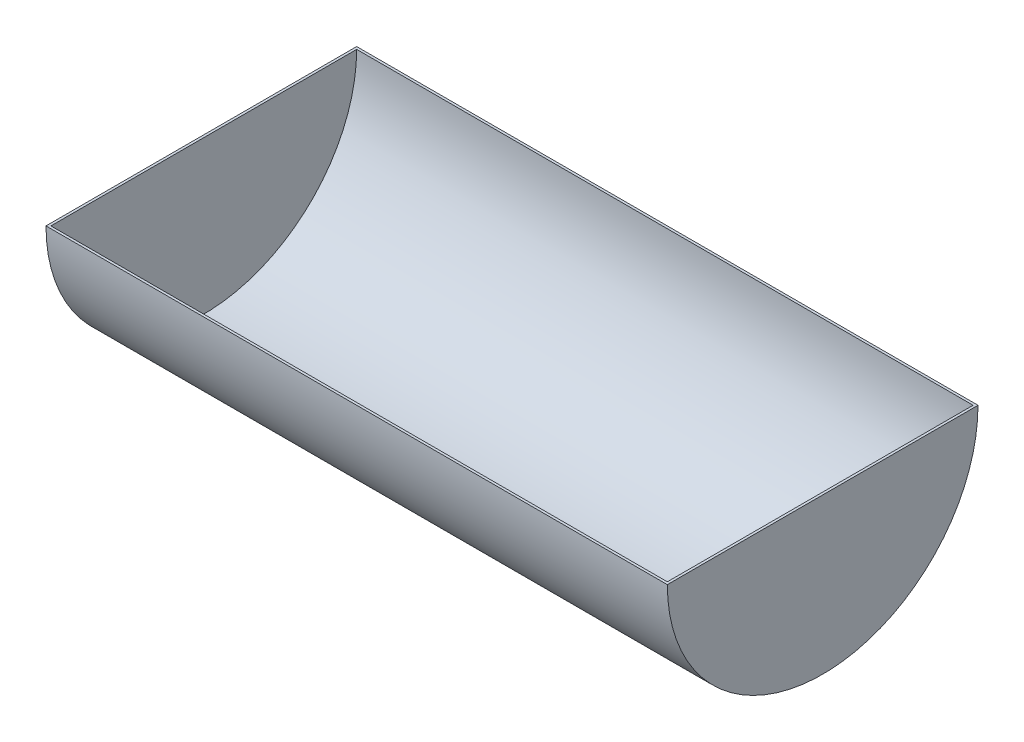
ISO-10303-21;
HEADER;
FILE_DESCRIPTION(('STEP AP214'),'2;1');
FILE_NAME('part.step','',(''),(''),'','','');
FILE_SCHEMA(('AUTOMOTIVE_DESIGN { 1 0 10303 214 1 1 1 1 }'));
ENDSEC;
DATA;
#1=APPLICATION_CONTEXT('core data for automotive mechanical design processes');
#2=APPLICATION_PROTOCOL_DEFINITION('international standard','automotive_design',2000,#1);
#3=PRODUCT_CONTEXT('',#1,'mechanical');
#4=PRODUCT('Part','Part','',(#3));
#5=PRODUCT_RELATED_PRODUCT_CATEGORY('part','',(#4));
#6=PRODUCT_DEFINITION_FORMATION('','',#4);
#7=PRODUCT_DEFINITION_CONTEXT('part definition',#1,'design');
#8=PRODUCT_DEFINITION('design','',#6,#7);
#9=PRODUCT_DEFINITION_SHAPE('','',#8);
#10=(LENGTH_UNIT() NAMED_UNIT(*) SI_UNIT(.MILLI.,.METRE.));
#11=(NAMED_UNIT(*) PLANE_ANGLE_UNIT() SI_UNIT($,.RADIAN.));
#12=(NAMED_UNIT(*) SI_UNIT($,.STERADIAN.) SOLID_ANGLE_UNIT());
#13=UNCERTAINTY_MEASURE_WITH_UNIT(LENGTH_MEASURE(1.E-05),#10,'distance_accuracy_value','');
#14=(GEOMETRIC_REPRESENTATION_CONTEXT(3) GLOBAL_UNCERTAINTY_ASSIGNED_CONTEXT((#13)) GLOBAL_UNIT_ASSIGNED_CONTEXT((#10,
#11,#12)) REPRESENTATION_CONTEXT('',''));
#15=CARTESIAN_POINT('',(0.,0.,0.));
#16=DIRECTION('',(0.,0.,1.));
#17=DIRECTION('',(1.,0.,0.));
#18=AXIS2_PLACEMENT_3D('',#15,#16,#17);
#19=CARTESIAN_POINT('',(508.,0.,0.));
#20=DIRECTION('',(-1.,0.,0.));
#21=DIRECTION('',(0.,0.,1.));
#22=AXIS2_PLACEMENT_3D('',#19,#20,#21);
#23=CYLINDRICAL_SURFACE('',#22,125.);
#24=DIRECTION('',(-1.,0.,0.));
#25=VECTOR('',#24,1.);
#26=CARTESIAN_POINT('',(508.,0.,-125.));
#27=LINE('',#26,#25);
#28=CARTESIAN_POINT('',(506.,0.,-125.));
#29=VERTEX_POINT('',#28);
#30=CARTESIAN_POINT('',(2.,0.,-125.));
#31=VERTEX_POINT('',#30);
#32=EDGE_CURVE('E53',#29,#31,#27,.T.);
#33=ORIENTED_EDGE('',*,*,#32,.T.);
#34=CARTESIAN_POINT('',(2.,0.,0.));
#35=DIRECTION('',(1.,0.,0.));
#36=DIRECTION('',(0.,0.,-1.));
#37=AXIS2_PLACEMENT_3D('',#34,#35,#36);
#38=CIRCLE('',#37,125.);
#39=CARTESIAN_POINT('',(2.,0.,125.));
#40=VERTEX_POINT('',#39);
#41=EDGE_CURVE('E49',#40,#31,#38,.T.);
#42=ORIENTED_EDGE('',*,*,#41,.F.);
#43=DIRECTION('',(-1.,0.,0.));
#44=VECTOR('',#43,1.);
#45=CARTESIAN_POINT('',(508.,0.,125.));
#46=LINE('',#45,#44);
#47=CARTESIAN_POINT('',(506.,0.,125.));
#48=VERTEX_POINT('',#47);
#49=EDGE_CURVE('E11',#48,#40,#46,.T.);
#50=ORIENTED_EDGE('',*,*,#49,.F.);
#51=CARTESIAN_POINT('',(506.,0.,0.));
#52=DIRECTION('',(1.,0.,0.));
#53=DIRECTION('',(0.,0.,-1.));
#54=AXIS2_PLACEMENT_3D('',#51,#52,#53);
#55=CIRCLE('',#54,125.);
#56=EDGE_CURVE('E75',#48,#29,#55,.T.);
#57=ORIENTED_EDGE('',*,*,#56,.T.);
#58=EDGE_LOOP('',(#33,#42,#50,#57));
#59=FACE_BOUND('',#58,.T.);
#60=ADVANCED_FACE('F35',(#59),#23,.F.);
#61=CARTESIAN_POINT('',(508.,0.,0.));
#62=DIRECTION('',(-1.,0.,0.));
#63=DIRECTION('',(0.,0.,1.));
#64=AXIS2_PLACEMENT_3D('',#61,#62,#63);
#65=CYLINDRICAL_SURFACE('',#64,127.);
#66=CARTESIAN_POINT('',(0.,0.,0.));
#67=DIRECTION('',(1.,0.,0.));
#68=DIRECTION('',(0.,0.,-1.));
#69=AXIS2_PLACEMENT_3D('',#66,#67,#68);
#70=CIRCLE('',#69,127.);
#71=CARTESIAN_POINT('',(0.,0.,127.));
#72=VERTEX_POINT('',#71);
#73=CARTESIAN_POINT('',(0.,0.,-127.));
#74=VERTEX_POINT('',#73);
#75=EDGE_CURVE('E77',#72,#74,#70,.T.);
#76=ORIENTED_EDGE('',*,*,#75,.T.);
#77=DIRECTION('',(-1.,0.,0.));
#78=VECTOR('',#77,1.);
#79=CARTESIAN_POINT('',(508.,0.,-127.));
#80=LINE('',#79,#78);
#81=CARTESIAN_POINT('',(508.,0.,-127.));
#82=VERTEX_POINT('',#81);
#83=EDGE_CURVE('E85',#82,#74,#80,.T.);
#84=ORIENTED_EDGE('',*,*,#83,.F.);
#85=CARTESIAN_POINT('',(508.,0.,0.));
#86=DIRECTION('',(1.,0.,0.));
#87=DIRECTION('',(0.,0.,-1.));
#88=AXIS2_PLACEMENT_3D('',#85,#86,#87);
#89=CIRCLE('',#88,127.);
#90=CARTESIAN_POINT('',(508.,0.,127.));
#91=VERTEX_POINT('',#90);
#92=EDGE_CURVE('E86',#91,#82,#89,.T.);
#93=ORIENTED_EDGE('',*,*,#92,.F.);
#94=DIRECTION('',(-1.,0.,0.));
#95=VECTOR('',#94,1.);
#96=CARTESIAN_POINT('',(508.,0.,127.));
#97=LINE('',#96,#95);
#98=EDGE_CURVE('E42',#91,#72,#97,.T.);
#99=ORIENTED_EDGE('',*,*,#98,.T.);
#100=EDGE_LOOP('',(#76,#84,#93,#99));
#101=FACE_BOUND('',#100,.T.);
#102=ADVANCED_FACE('F101',(#101),#65,.T.);
#103=CARTESIAN_POINT('',(508.,0.,-127.));
#104=DIRECTION('',(0.,-1.,0.));
#105=DIRECTION('',(0.,0.,-1.));
#106=AXIS2_PLACEMENT_3D('',#103,#104,#105);
#107=PLANE('',#106);
#108=DIRECTION('',(0.,0.,1.));
#109=VECTOR('',#108,1.);
#110=CARTESIAN_POINT('',(2.,0.,125.));
#111=LINE('',#110,#109);
#112=EDGE_CURVE('E79',#31,#40,#111,.T.);
#113=ORIENTED_EDGE('',*,*,#112,.F.);
#114=ORIENTED_EDGE('',*,*,#32,.F.);
#115=DIRECTION('',(0.,0.,1.));
#116=VECTOR('',#115,1.);
#117=CARTESIAN_POINT('',(506.,0.,125.));
#118=LINE('',#117,#116);
#119=EDGE_CURVE('E73',#29,#48,#118,.T.);
#120=ORIENTED_EDGE('',*,*,#119,.T.);
#121=ORIENTED_EDGE('',*,*,#49,.T.);
#122=EDGE_LOOP('',(#113,#114,#120,#121));
#123=FACE_BOUND('',#122,.T.);
#124=DIRECTION('',(0.,0.,1.));
#125=VECTOR('',#124,1.);
#126=CARTESIAN_POINT('',(0.,0.,-127.));
#127=LINE('',#126,#125);
#128=EDGE_CURVE('E94',#74,#72,#127,.T.);
#129=ORIENTED_EDGE('',*,*,#128,.T.);
#130=ORIENTED_EDGE('',*,*,#98,.F.);
#131=DIRECTION('',(0.,0.,1.));
#132=VECTOR('',#131,1.);
#133=CARTESIAN_POINT('',(508.,0.,127.));
#134=LINE('',#133,#132);
#135=EDGE_CURVE('E91',#82,#91,#134,.T.);
#136=ORIENTED_EDGE('',*,*,#135,.F.);
#137=ORIENTED_EDGE('',*,*,#83,.T.);
#138=EDGE_LOOP('',(#129,#130,#136,#137));
#139=FACE_BOUND('',#138,.T.);
#140=ADVANCED_FACE('F82',(#123,#139),#107,.F.);
#141=CARTESIAN_POINT('',(508.,0.,0.));
#142=DIRECTION('',(1.,0.,0.));
#143=DIRECTION('',(0.,0.,-1.));
#144=AXIS2_PLACEMENT_3D('',#141,#142,#143);
#145=PLANE('',#144);
#146=ORIENTED_EDGE('',*,*,#92,.T.);
#147=ORIENTED_EDGE('',*,*,#135,.T.);
#148=EDGE_LOOP('',(#146,#147));
#149=FACE_BOUND('',#148,.T.);
#150=ADVANCED_FACE('F124',(#149),#145,.T.);
#151=CARTESIAN_POINT('',(0.,0.,0.));
#152=DIRECTION('',(1.,0.,0.));
#153=DIRECTION('',(0.,0.,-1.));
#154=AXIS2_PLACEMENT_3D('',#151,#152,#153);
#155=PLANE('',#154);
#156=ORIENTED_EDGE('',*,*,#75,.F.);
#157=ORIENTED_EDGE('',*,*,#128,.F.);
#158=EDGE_LOOP('',(#156,#157));
#159=FACE_BOUND('',#158,.T.);
#160=ADVANCED_FACE('F105',(#159),#155,.F.);
#161=CARTESIAN_POINT('',(506.,0.,0.));
#162=DIRECTION('',(1.,0.,0.));
#163=DIRECTION('',(0.,0.,-1.));
#164=AXIS2_PLACEMENT_3D('',#161,#162,#163);
#165=PLANE('',#164);
#166=ORIENTED_EDGE('',*,*,#56,.F.);
#167=ORIENTED_EDGE('',*,*,#119,.F.);
#168=EDGE_LOOP('',(#166,#167));
#169=FACE_BOUND('',#168,.T.);
#170=ADVANCED_FACE('F74',(#169),#165,.F.);
#171=CARTESIAN_POINT('',(2.,0.,0.));
#172=DIRECTION('',(1.,0.,0.));
#173=DIRECTION('',(0.,0.,-1.));
#174=AXIS2_PLACEMENT_3D('',#171,#172,#173);
#175=PLANE('',#174);
#176=ORIENTED_EDGE('',*,*,#41,.T.);
#177=ORIENTED_EDGE('',*,*,#112,.T.);
#178=EDGE_LOOP('',(#176,#177));
#179=FACE_BOUND('',#178,.T.);
#180=ADVANCED_FACE('F110',(#179),#175,.T.);
#181=CLOSED_SHELL('',(#60,#102,#140,#150,#160,#170,#180));
#182=MANIFOLD_SOLID_BREP('B2',#181);
#183=ADVANCED_BREP_SHAPE_REPRESENTATION('',(#18,#182),#14);
#184=SHAPE_DEFINITION_REPRESENTATION(#9,#183);
ENDSEC;
END-ISO-10303-21;
